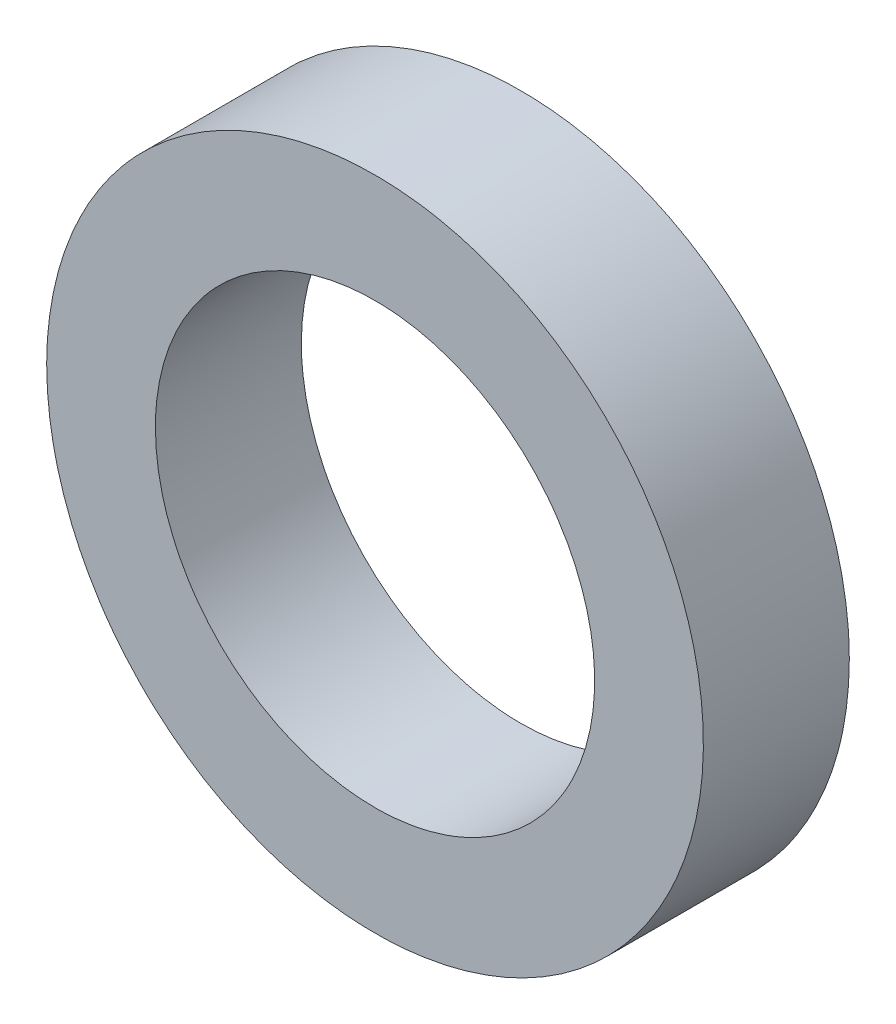
ISO-10303-21;
HEADER;
FILE_DESCRIPTION(('STEP AP214'),'2;1');
FILE_NAME('part.step','',(''),(''),'','','');
FILE_SCHEMA(('AUTOMOTIVE_DESIGN { 1 0 10303 214 1 1 1 1 }'));
ENDSEC;
DATA;
#1=APPLICATION_CONTEXT('core data for automotive mechanical design processes');
#2=APPLICATION_PROTOCOL_DEFINITION('international standard','automotive_design',2000,#1);
#3=PRODUCT_CONTEXT('',#1,'mechanical');
#4=PRODUCT('Part','Part','',(#3));
#5=PRODUCT_RELATED_PRODUCT_CATEGORY('part','',(#4));
#6=PRODUCT_DEFINITION_FORMATION('','',#4);
#7=PRODUCT_DEFINITION_CONTEXT('part definition',#1,'design');
#8=PRODUCT_DEFINITION('design','',#6,#7);
#9=PRODUCT_DEFINITION_SHAPE('','',#8);
#10=(LENGTH_UNIT() NAMED_UNIT(*) SI_UNIT(.MILLI.,.METRE.));
#11=(NAMED_UNIT(*) PLANE_ANGLE_UNIT() SI_UNIT($,.RADIAN.));
#12=(NAMED_UNIT(*) SI_UNIT($,.STERADIAN.) SOLID_ANGLE_UNIT());
#13=UNCERTAINTY_MEASURE_WITH_UNIT(LENGTH_MEASURE(1.E-05),#10,'distance_accuracy_value','');
#14=(GEOMETRIC_REPRESENTATION_CONTEXT(3) GLOBAL_UNCERTAINTY_ASSIGNED_CONTEXT((#13)) GLOBAL_UNIT_ASSIGNED_CONTEXT((#10,
#11,#12)) REPRESENTATION_CONTEXT('',''));
#15=CARTESIAN_POINT('',(0.,0.,0.));
#16=DIRECTION('',(0.,0.,1.));
#17=DIRECTION('',(1.,0.,0.));
#18=AXIS2_PLACEMENT_3D('',#15,#16,#17);
#19=CARTESIAN_POINT('',(6.,0.,31.3));
#20=CARTESIAN_POINT('',(6.,0.,29.3));
#21=(BOUNDED_CURVE() B_SPLINE_CURVE(1,(#19,#20),.UNSPECIFIED.,.F.,
.F.) B_SPLINE_CURVE_WITH_KNOTS((2,2),(0.,1.),
.UNSPECIFIED.) CURVE() GEOMETRIC_REPRESENTATION_ITEM() RATIONAL_B_SPLINE_CURVE((1.,1.)) REPRESENTATION_ITEM(''));
#22=CARTESIAN_POINT('',(10.5,0.,29.3));
#23=DIRECTION('',(0.,0.,-1.));
#24=AXIS1_PLACEMENT('',#22,#23);
#25=SURFACE_OF_REVOLUTION('',#21,#24);
#26=CARTESIAN_POINT('',(6.,-2.6937762327139E-10,31.3));
#27=CARTESIAN_POINT('',(6.00000075711518,-0.126345888243587,31.3));
#28=CARTESIAN_POINT('',(6.0053258516271,-0.252714995639869,31.3));
#29=CARTESIAN_POINT('',(6.02659161018522,-0.504579922893915,31.3));
#30=CARTESIAN_POINT('',(6.0425354082801,-0.630075473873856,31.3));
#31=CARTESIAN_POINT('',(6.0849668385989,-0.879488579669032,31.3));
#32=CARTESIAN_POINT('',(6.11147120795696,-1.00340330580344,31.3));
#33=CARTESIAN_POINT('',(6.17484109540289,-1.24862839271339,31.3));
#34=CARTESIAN_POINT('',(6.21171502163007,-1.36993655368026,31.3));
#35=CARTESIAN_POINT('',(6.33738125664592,-1.72813230663829,31.3));
#36=CARTESIAN_POINT('',(6.44132124238062,-1.95989398203193,31.3));
#37=CARTESIAN_POINT('',(6.68669098236688,-2.40265211702302,31.3));
#38=CARTESIAN_POINT('',(6.8281221617637,-2.61364778682825,31.3));
#39=CARTESIAN_POINT('',(7.0651658796266,-2.90998197074079,31.3));
#40=CARTESIAN_POINT('',(7.14839252706893,-3.00545596733886,31.3));
#41=CARTESIAN_POINT('',(7.32252955954329,-3.18898845132688,31.3));
#42=CARTESIAN_POINT('',(7.41343245892862,-3.27705399963326,31.3));
#43=CARTESIAN_POINT('',(7.60236863328452,-3.44524943311484,31.3));
#44=CARTESIAN_POINT('',(7.70040511960203,-3.52537570543001,31.3));
#45=CARTESIAN_POINT('',(7.90290374292955,-3.67710475387021,31.3));
#46=CARTESIAN_POINT('',(8.00736736293391,-3.74870555155881,31.3));
#47=CARTESIAN_POINT('',(8.22191990853169,-3.88282771925992,31.3));
#48=CARTESIAN_POINT('',(8.33200692234022,-3.94535214755635,31.3));
#49=CARTESIAN_POINT('',(8.55709534180762,-4.06092787559734,31.3));
#50=CARTESIAN_POINT('',(8.67209854340924,-4.11397567612515,31.3));
#51=CARTESIAN_POINT('',(8.90612952534069,-4.21017454227091,31.3));
#52=CARTESIAN_POINT('',(9.02515575188753,-4.25332937977116,31.3));
#53=CARTESIAN_POINT('',(9.2664330930061,-4.32947371902587,31.3));
#54=CARTESIAN_POINT('',(9.38868539768695,-4.3624594107949,31.3));
#55=CARTESIAN_POINT('',(9.75887477059496,-4.44573644165291,31.3));
#56=CARTESIAN_POINT('',(10.0104981527046,-4.48045178750392,31.3));
#57=CARTESIAN_POINT('',(10.5159997363534,-4.50708378966814,31.3));
#58=CARTESIAN_POINT('',(10.7698779378925,-4.49900044598134,31.3));
#59=CARTESIAN_POINT('',(11.1467684743442,-4.4550828047009,31.3));
#60=CARTESIAN_POINT('',(11.2718100379565,-4.43512561976273,31.3));
#61=CARTESIAN_POINT('',(11.5197527061042,-4.38475549915935,31.3));
#62=CARTESIAN_POINT('',(11.6426545938186,-4.3543464774409,31.3));
#63=CARTESIAN_POINT('',(11.8854982867655,-4.28327142452189,31.3));
#64=CARTESIAN_POINT('',(12.0054389431545,-4.24260147905303,31.3));
#65=CARTESIAN_POINT('',(12.2414256406672,-4.15131717543181,31.3));
#66=CARTESIAN_POINT('',(12.3574731001043,-4.10070648583707,31.3));
#67=CARTESIAN_POINT('',(12.5849310529537,-3.98987133628193,31.3));
#68=CARTESIAN_POINT('',(12.6963399665197,-3.92964363408343,31.3));
#69=CARTESIAN_POINT('',(12.913660804081,-3.80003248428611,31.3));
#70=CARTESIAN_POINT('',(13.0195739949729,-3.73065115999981,31.3));
#71=CARTESIAN_POINT('',(13.2251377017827,-3.58323968057264,31.3));
#72=CARTESIAN_POINT('',(13.3247910316415,-3.50521345572992,31.3));
#73=CARTESIAN_POINT('',(13.5172490939623,-3.34099478137929,31.3));
#74=CARTESIAN_POINT('',(13.6100471241572,-3.25479452347449,31.3));
#75=CARTESIAN_POINT('',(13.8769164865168,-2.98500865251915,31.3));
#76=CARTESIAN_POINT('',(14.0397355005387,-2.79004219423704,31.3));
#77=CARTESIAN_POINT('',(14.3302705772644,-2.37551783476742,31.3));
#78=CARTESIAN_POINT('',(14.457987974235,-2.15596086874983,31.3));
#79=CARTESIAN_POINT('',(14.6205966550807,-1.8129526808387,31.3));
#80=CARTESIAN_POINT('',(14.6700131440081,-1.69619067085795,31.3));
#81=CARTESIAN_POINT('',(14.7587997294127,-1.45898184273923,31.3));
#82=CARTESIAN_POINT('',(14.7981779563333,-1.33853809573375,31.3));
#83=CARTESIAN_POINT('',(14.8665820622822,-1.09496428369583,31.3));
#84=CARTESIAN_POINT('',(14.8956242885602,-0.971838790372174,31.3));
#85=CARTESIAN_POINT('',(14.9432375239037,-0.723602705389449,31.3));
#86=CARTESIAN_POINT('',(14.9618116214151,-0.59849271043604,31.3));
#87=CARTESIAN_POINT('',(14.9833857117301,-0.394324004665475,31.3));
#88=CARTESIAN_POINT('',(14.9896140981964,-0.315592182409609,31.3));
#89=CARTESIAN_POINT('',(14.9979214788967,-0.157909930030292,31.3));
#90=CARTESIAN_POINT('',(15.0000004731306,-0.07895949990684,31.3));
#91=CARTESIAN_POINT('',(14.9999992429269,0.12634588674299,31.3));
#92=CARTESIAN_POINT('',(14.9946741484572,0.252714994140696,31.3));
#93=CARTESIAN_POINT('',(14.9734083899831,0.504579921401214,31.3));
#94=CARTESIAN_POINT('',(14.9574645919302,0.630075472386204,31.3));
#95=CARTESIAN_POINT('',(14.9150331616946,0.879488578195656,31.3));
#96=CARTESIAN_POINT('',(14.8885287923778,1.00340330433929,31.3));
#97=CARTESIAN_POINT('',(14.8251589050135,1.24862839127106,31.3));
#98=CARTESIAN_POINT('',(14.7882849788267,1.36993655225053,31.3));
#99=CARTESIAN_POINT('',(14.6626187439301,1.72813230525073,31.3));
#100=CARTESIAN_POINT('',(14.5586787582727,1.95989398067901,31.3));
#101=CARTESIAN_POINT('',(14.313309018434,2.40265211575189,31.3));
#102=CARTESIAN_POINT('',(14.1718778391075,2.61364778560428,31.3));
#103=CARTESIAN_POINT('',(13.9348341213434,2.90998196959583,31.3));
#104=CARTESIAN_POINT('',(13.8516074739329,3.00545596622163,31.3));
#105=CARTESIAN_POINT('',(13.6774704415198,3.18898845026767,31.3));
#106=CARTESIAN_POINT('',(13.5865675421638,3.27705399860433,31.3));
#107=CARTESIAN_POINT('',(13.397631367864,3.44524943214889,31.3));
#108=CARTESIAN_POINT('',(13.2995948815732,3.52537570449676,31.3));
#109=CARTESIAN_POINT('',(13.0970962582962,3.67710475300449,31.3));
#110=CARTESIAN_POINT('',(12.9926326383157,3.74870555072793,31.3));
#111=CARTESIAN_POINT('',(12.7780800927626,3.88282771850056,31.3));
#112=CARTESIAN_POINT('',(12.6679930789749,3.94535214683369,31.3));
#113=CARTESIAN_POINT('',(12.442904659546,4.06092787494971,31.3));
#114=CARTESIAN_POINT('',(12.3279014579621,4.11397567551586,31.3));
#115=CARTESIAN_POINT('',(12.0938704760627,4.21017454173963,31.3));
#116=CARTESIAN_POINT('',(11.9748442495302,4.25332937927955,31.3));
#117=CARTESIAN_POINT('',(11.7335669084371,4.32947371861468,31.3));
#118=CARTESIAN_POINT('',(11.6113146037672,4.36245941042446,31.3));
#119=CARTESIAN_POINT('',(11.241125230887,4.44573644140587,31.3));
#120=CARTESIAN_POINT('',(10.9895018487888,4.48045178734075,31.3));
#121=CARTESIAN_POINT('',(10.484000265149,4.50708378967347,31.3));
#122=CARTESIAN_POINT('',(10.2301220636072,4.4990004460713,31.3));
#123=CARTESIAN_POINT('',(9.85323152714079,4.45508280491649,31.3));
#124=CARTESIAN_POINT('',(9.72818996352185,4.43512562002,31.3));
#125=CARTESIAN_POINT('',(9.4802472953574,4.38475549949926,31.3));
#126=CARTESIAN_POINT('',(9.3573454076328,4.35434647782177,31.3));
#127=CARTESIAN_POINT('',(9.11450171466221,4.28327142498372,31.3));
#128=CARTESIAN_POINT('',(8.99456105825965,4.24260147955484,31.3));
#129=CARTESIAN_POINT('',(8.75857436071658,4.15131717601228,31.3));
#130=CARTESIAN_POINT('',(8.64252690126255,4.10070648645623,31.3));
#131=CARTESIAN_POINT('',(8.41506894837624,3.98987133697692,31.3));
#132=CARTESIAN_POINT('',(8.3036600347902,3.92964363481556,31.3));
#133=CARTESIAN_POINT('',(8.08633919718572,3.8000324850907,31.3));
#134=CARTESIAN_POINT('',(7.98042600627076,3.73065116083973,31.3));
#135=CARTESIAN_POINT('',(7.77486229941181,3.58323968148108,31.3));
#136=CARTESIAN_POINT('',(7.67520896952696,3.50521345667157,31.3));
#137=CARTESIAN_POINT('',(7.48275090715136,3.34099478238506,31.3));
#138=CARTESIAN_POINT('',(7.38995287692778,3.25479452451118,31.3));
#139=CARTESIAN_POINT('',(7.12308351447821,2.9850086536448,31.3));
#140=CARTESIAN_POINT('',(6.9602645003913,2.79004219541698,31.3));
#141=CARTESIAN_POINT('',(6.66972942352741,2.37551783604421,31.3));
#142=CARTESIAN_POINT('',(6.54201202648363,2.15596087006918,31.3));
#143=CARTESIAN_POINT('',(6.37940334552374,1.81295268221252,31.3));
#144=CARTESIAN_POINT('',(6.32998685655756,1.69619067224854,31.3));
#145=CARTESIAN_POINT('',(6.24120027107411,1.4589818441601,31.3));
#146=CARTESIAN_POINT('',(6.20182204411344,1.33853809716812,31.3));
#147=CARTESIAN_POINT('',(6.13341793808326,1.09496428515315,31.3));
#148=CARTESIAN_POINT('',(6.10437571176404,0.971838791838917,31.3));
#149=CARTESIAN_POINT('',(6.05676247633764,0.723602706871464,31.3));
#150=CARTESIAN_POINT('',(6.03818837878446,0.598492711923901,31.3));
#151=CARTESIAN_POINT('',(6.01661428834876,0.394324005662689,31.3));
#152=CARTESIAN_POINT('',(6.01038590182986,0.315592182908908,31.3));
#153=CARTESIAN_POINT('',(6.002078521077,0.15790992953099,31.3));
#154=CARTESIAN_POINT('',(5.99999952684305,0.0789594989068522,31.3));
#155=CARTESIAN_POINT('',(6.,-2.6937762327139E-10,31.3));
#156=B_SPLINE_CURVE_WITH_KNOTS('',3,(#26,#27,#28,#29,#30,#31,#32,#33,#34,#35,#36,#37,#38,#39,
#40,#41,#42,#43,#44,#45,#46,#47,#48,#49,#50,#51,#52,#53,#54,#55,#56,#57,#58,#59,#60,#61,#62,#63,
#64,#65,#66,#67,#68,#69,#70,#71,#72,#73,#74,#75,#76,#77,#78,#79,#80,#81,#82,#83,#84,#85,#86,#87,
#88,#89,#90,#91,#92,#93,#94,#95,#96,#97,#98,#99,#100,#101,#102,#103,#104,#105,#106,#107,#108,
#109,#110,#111,#112,#113,#114,#115,#116,#117,#118,#119,#120,#121,#122,#123,#124,#125,#126,#127,
#128,#129,#130,#131,#132,#133,#134,#135,#136,#137,#138,#139,#140,#141,#142,#143,#144,#145,#146,
#147,#148,#149,#150,#151,#152,#153,#154,#155),.UNSPECIFIED.,.T.,.F.,(4,2,2,2,2,2,2,2,2,2,2,2,2,
2,2,2,2,2,2,2,2,2,2,2,2,2,2,2,2,2,2,2,2,2,2,2,2,2,2,2,2,2,2,2,2,2,2,2,2,2,2,2,2,2,2,2,2,2,2,2,2,
2,2,2,4),(0.,0.378964974276814,0.758041847459797,1.13772191331395,1.51771073427411,
2.27587701437876,3.03407211864041,3.41366643018824,3.79289475564697,4.17229486835694,
4.55178285442527,4.931142673675,5.31064228217768,5.68999695761862,6.06949359033223,
6.82767428251637,7.58585497470049,7.96535160741409,8.34470628285502,8.72420589135772,
9.10356571060745,9.48305369667585,9.86245380938588,10.2416821348445,10.6212764463923,
11.379471550654,12.1376378307586,12.5176266517197,12.897306717575,13.2763835907573,
13.6553485650327,13.8921816338769,14.1290147027211,14.5079796769966,14.8870565501788,
15.2667366160341,15.6467254369952,16.4048917170998,17.1630868213615,17.5426811329093,
17.921909458368,18.301309571078,18.6807975571464,19.0601573763961,19.4396569848988,
19.8190116603398,20.1985082930534,20.9566889852375,21.7148696774216,22.0943663101352,
22.4737209855762,22.8532205940789,23.2325804133286,23.6120683993969,23.9914685121069,
24.3706968375656,24.7502911491134,25.5084862533751,26.2666525334797,26.6466413544399,
27.026321420294,27.405398293477,27.7843632677538,28.0211963380975,28.2580294084412),.UNSPECIFIED.);
#157=CARTESIAN_POINT('',(6.,-2.6937762327139E-10,31.3));
#158=VERTEX_POINT('',#157);
#159=EDGE_CURVE('E20',#158,#158,#156,.T.);
#160=ORIENTED_EDGE('',*,*,#159,.F.);
#161=EDGE_LOOP('',(#160));
#162=FACE_BOUND('',#161,.T.);
#163=CARTESIAN_POINT('',(15.,-1.23062105352878E-09,29.3));
#164=CARTESIAN_POINT('',(14.9999992428578,-0.12634588920483,29.3));
#165=CARTESIAN_POINT('',(14.9946741483189,-0.252714996599976,29.3));
#166=CARTESIAN_POINT('',(14.973408389707,-0.504579923849479,29.3));
#167=CARTESIAN_POINT('',(14.9574645915853,-0.630075474826015,29.3));
#168=CARTESIAN_POINT('',(14.9150331612132,-0.879488580612127,29.3));
#169=CARTESIAN_POINT('',(14.8885287918287,-1.00340330674088,29.3));
#170=CARTESIAN_POINT('',(14.8251589043304,-1.24862839363728,29.3));
#171=CARTESIAN_POINT('',(14.7882849780773,-1.36993655459628,29.3));
#172=CARTESIAN_POINT('',(14.6626187429849,-1.72813230752747,29.3));
#173=CARTESIAN_POINT('',(14.5586787572007,-1.95989398289891,29.3));
#174=CARTESIAN_POINT('',(14.3133090171199,-2.40265211783758,29.3));
#175=CARTESIAN_POINT('',(14.171877837678,-2.6136477876126,29.3));
#176=CARTESIAN_POINT('',(13.9348341197518,-2.9099819714745,29.3));
#177=CARTESIAN_POINT('',(13.8516074722891,-3.0054559680548,29.3));
#178=CARTESIAN_POINT('',(13.6774704397755,-3.18898845200562,29.3));
#179=CARTESIAN_POINT('',(13.5865675403714,-3.27705400029258,29.3));
#180=CARTESIAN_POINT('',(13.3976313659795,-3.4452494337338,29.3));
#181=CARTESIAN_POINT('',(13.2995948796449,-3.52537570602803,29.3));
#182=CARTESIAN_POINT('',(13.097096256285,-3.67710475442498,29.3));
#183=CARTESIAN_POINT('',(12.9926326362653,-3.74870555209126,29.3));
#184=CARTESIAN_POINT('',(12.7780800906389,-3.88282771974654,29.3));
#185=CARTESIAN_POINT('',(12.667993076817,-3.94535214801946,29.3));
#186=CARTESIAN_POINT('',(12.4429046573249,-4.06092787601236,29.3));
#187=CARTESIAN_POINT('',(12.327901455712,-4.11397567651561,29.3));
#188=CARTESIAN_POINT('',(12.09387047376,-4.21017454261137,29.3));
#189=CARTESIAN_POINT('',(11.9748442472039,-4.2533293800862,29.3));
#190=CARTESIAN_POINT('',(11.7335669060691,-4.32947371928937,29.3));
#191=CARTESIAN_POINT('',(11.6113146013812,-4.36245941103229,29.3));
#192=CARTESIAN_POINT('',(11.2411252284554,-4.44573644181122,29.3));
#193=CARTESIAN_POINT('',(10.9895018463383,-4.48045178760849,29.3));
#194=CARTESIAN_POINT('',(10.4840002626839,-4.50708378966472,29.3));
#195=CARTESIAN_POINT('',(10.2301220611465,-4.49900044592369,29.3));
#196=CARTESIAN_POINT('',(9.85323152470412,-4.45508280456274,29.3));
#197=CARTESIAN_POINT('',(9.7281899610961,-4.43512561959786,29.3));
#198=CARTESIAN_POINT('',(9.4802472929592,-4.38475549894152,29.3));
#199=CARTESIAN_POINT('',(9.35734540525124,-4.35434647719681,29.3));
#200=CARTESIAN_POINT('',(9.11450171231952,-4.28327142422593,29.3));
#201=CARTESIAN_POINT('',(8.99456105593921,-4.24260147873145,29.3));
#202=CARTESIAN_POINT('',(8.75857435844606,-4.15131717505983,29.3));
#203=CARTESIAN_POINT('',(8.6425268990197,-4.1007064854403,29.3));
#204=CARTESIAN_POINT('',(8.41506894619399,-3.98987133583657,29.3));
#205=CARTESIAN_POINT('',(8.30366003264087,-3.92964363361427,29.3));
#206=CARTESIAN_POINT('',(8.08633919510725,-3.80003248377053,29.3));
#207=CARTESIAN_POINT('',(7.98042600423022,-3.73065115946161,29.3));
#208=CARTESIAN_POINT('',(7.7748622974519,-3.58323967999053,29.3));
#209=CARTESIAN_POINT('',(7.67520896760975,-3.50521345512652,29.3));
#210=CARTESIAN_POINT('',(7.482750905324,-3.34099478073477,29.3));
#211=CARTESIAN_POINT('',(7.38995287514758,-3.25479452281015,29.3));
#212=CARTESIAN_POINT('',(7.12308351284557,-2.9850086517978,29.3));
#213=CARTESIAN_POINT('',(6.96026449886528,-2.79004219348092,29.3));
#214=CARTESIAN_POINT('',(6.66972942222812,-2.37551783394924,29.3));
#215=CARTESIAN_POINT('',(6.54201202530444,-2.15596086790437,29.3));
#216=CARTESIAN_POINT('',(6.37940334453202,-1.8129526799585,29.3));
#217=CARTESIAN_POINT('',(6.32998685562959,-1.69619066996719,29.3));
#218=CARTESIAN_POINT('',(6.24120027027568,-1.45898184182951,29.3));
#219=CARTESIAN_POINT('',(6.20182204338081,-1.33853809481561,29.3));
#220=CARTESIAN_POINT('',(6.13341793748393,-1.09496428276308,29.3));
#221=CARTESIAN_POINT('',(6.10437571123216,-0.971838789433221,29.3));
#222=CARTESIAN_POINT('',(6.05676247594173,-0.723602704440324,29.3));
#223=CARTESIAN_POINT('',(6.03818837845706,-0.598492709482948,29.3));
#224=CARTESIAN_POINT('',(6.01661428818562,-0.394324003707775,29.3));
#225=CARTESIAN_POINT('',(6.01038590173614,-0.31559218145058,29.3));
#226=CARTESIAN_POINT('',(6.00207852106958,-0.157909929069491,29.3));
#227=CARTESIAN_POINT('',(5.9999995268525,-0.0789594989455955,29.3));
#228=CARTESIAN_POINT('',(6.00000075710005,0.126345887704233,29.3));
#229=CARTESIAN_POINT('',(6.0053258515968,0.252714995100802,29.3));
#230=CARTESIAN_POINT('',(6.02659161012464,0.504579922356777,29.3));
#231=CARTESIAN_POINT('',(6.04253540820441,0.630075473338361,29.3));
#232=CARTESIAN_POINT('',(6.08496683849326,0.87948857913875,29.3));
#233=CARTESIAN_POINT('',(6.11147120783652,1.00340330527672,29.3));
#234=CARTESIAN_POINT('',(6.17484109525322,1.24862839219495,29.3));
#235=CARTESIAN_POINT('',(6.21171502146595,1.36993655316655,29.3));
#236=CARTESIAN_POINT('',(6.33738125643902,1.72813230613991,29.3));
#237=CARTESIAN_POINT('',(6.44132124214596,1.95989398154599,29.3));
#238=CARTESIAN_POINT('',(6.68669098207921,2.40265211656645,29.3));
#239=CARTESIAN_POINT('',(6.82812216145077,2.61364778638863,29.3));
#240=CARTESIAN_POINT('',(7.06516587927819,2.90998197032954,29.3));
#241=CARTESIAN_POINT('',(7.14839252670908,3.00545596693757,29.3));
#242=CARTESIAN_POINT('',(7.32252955916144,3.1889884509464,29.3));
#243=CARTESIAN_POINT('',(7.41343245853621,3.27705399926365,29.3));
#244=CARTESIAN_POINT('',(7.60236863287196,3.44524943276786,29.3));
#245=CARTESIAN_POINT('',(7.70040511917989,3.52537570509478,29.3));
#246=CARTESIAN_POINT('',(7.90290374248928,3.67710475355925,29.3));
#247=CARTESIAN_POINT('',(8.00736736248509,3.74870555126038,29.3));
#248=CARTESIAN_POINT('',(8.22191990806682,3.88282771898718,29.3));
#249=CARTESIAN_POINT('',(8.33200692186787,3.9453521472968,29.3));
#250=CARTESIAN_POINT('',(8.55709534132144,4.06092787536474,29.3));
#251=CARTESIAN_POINT('',(8.67209854291672,4.11397567590631,29.3));
#252=CARTESIAN_POINT('',(8.90612952483665,4.21017454208009,29.3));
#253=CARTESIAN_POINT('',(9.02515575137832,4.25332937959459,29.3));
#254=CARTESIAN_POINT('',(9.26643309248776,4.32947371887818,29.3));
#255=CARTESIAN_POINT('',(9.38868539716467,4.36245941066185,29.3));
#256=CARTESIAN_POINT('',(9.75887477006269,4.44573644156418,29.3));
#257=CARTESIAN_POINT('',(10.0104981521682,4.48045178744532,29.3));
#258=CARTESIAN_POINT('',(10.5159997358138,4.50708378967005,29.3));
#259=CARTESIAN_POINT('',(10.7698779373538,4.49900044601365,29.3));
#260=CARTESIAN_POINT('',(11.1467684738109,4.45508280477833,29.3));
#261=CARTESIAN_POINT('',(11.2718100374255,4.43512561985513,29.3));
#262=CARTESIAN_POINT('',(11.5197527055792,4.38475549928143,29.3));
#263=CARTESIAN_POINT('',(11.6426545932973,4.35434647757769,29.3));
#264=CARTESIAN_POINT('',(11.8854982862527,4.28327142468776,29.3));
#265=CARTESIAN_POINT('',(12.0054389426466,4.24260147923326,29.3));
#266=CARTESIAN_POINT('',(12.2414256401702,4.1513171756403,29.3));
#267=CARTESIAN_POINT('',(12.3574730996134,4.10070648605945,29.3));
#268=CARTESIAN_POINT('',(12.584931052476,3.98987133653156,29.3));
#269=CARTESIAN_POINT('',(12.6963399660492,3.9296436343464,29.3));
#270=CARTESIAN_POINT('',(12.913660803626,3.80003248457512,29.3));
#271=CARTESIAN_POINT('',(13.0195739945261,3.73065116030152,29.3));
#272=CARTESIAN_POINT('',(13.2251377013536,3.58323968089897,29.3));
#273=CARTESIAN_POINT('',(13.3247910312218,3.50521345606816,29.3));
#274=CARTESIAN_POINT('',(13.5172490935623,3.34099478174055,29.3));
#275=CARTESIAN_POINT('',(13.6100471237675,3.25479452384685,29.3));
#276=CARTESIAN_POINT('',(13.8769164861594,2.98500865292346,29.3));
#277=CARTESIAN_POINT('',(14.0397355002047,2.79004219466086,29.3));
#278=CARTESIAN_POINT('',(14.33027057698,2.37551783522603,29.3));
#279=CARTESIAN_POINT('',(14.4579879739769,2.15596086922372,29.3));
#280=CARTESIAN_POINT('',(14.6205966548635,1.81295268133232,29.3));
#281=CARTESIAN_POINT('',(14.6700131438048,1.69619067135779,29.3));
#282=CARTESIAN_POINT('',(14.7587997292375,1.45898184325038,29.3));
#283=CARTESIAN_POINT('',(14.7981779561725,1.33853809624999,29.3));
#284=CARTESIAN_POINT('',(14.8665820621506,1.09496428422041,29.3));
#285=CARTESIAN_POINT('',(14.8956242884436,0.971838790899972,29.3));
#286=CARTESIAN_POINT('',(14.9432375238169,0.723602705922348,29.3));
#287=CARTESIAN_POINT('',(14.9618116213434,0.598492710970817,29.3));
#288=CARTESIAN_POINT('',(14.9833857117355,0.394324004704997,29.3));
#289=CARTESIAN_POINT('',(14.9896140982376,0.315592181949885,29.3));
#290=CARTESIAN_POINT('',(14.9979214789567,0.157909928570191,29.3));
#291=CARTESIAN_POINT('',(15.0000004731738,0.078959497945609,29.3));
#292=CARTESIAN_POINT('',(15.,-1.23062105352878E-09,29.3));
#293=B_SPLINE_CURVE_WITH_KNOTS('',3,(#163,#164,#165,#166,#167,#168,#169,#170,#171,#172,#173,
#174,#175,#176,#177,#178,#179,#180,#181,#182,#183,#184,#185,#186,#187,#188,#189,#190,#191,#192,
#193,#194,#195,#196,#197,#198,#199,#200,#201,#202,#203,#204,#205,#206,#207,#208,#209,#210,#211,
#212,#213,#214,#215,#216,#217,#218,#219,#220,#221,#222,#223,#224,#225,#226,#227,#228,#229,#230,
#231,#232,#233,#234,#235,#236,#237,#238,#239,#240,#241,#242,#243,#244,#245,#246,#247,#248,#249,
#250,#251,#252,#253,#254,#255,#256,#257,#258,#259,#260,#261,#262,#263,#264,#265,#266,#267,#268,
#269,#270,#271,#272,#273,#274,#275,#276,#277,#278,#279,#280,#281,#282,#283,#284,#285,#286,#287,
#288,#289,#290,#291,#292),.UNSPECIFIED.,.T.,.F.,(4,2,2,2,2,2,2,2,2,2,2,2,2,2,2,2,2,2,2,2,2,2,2,
2,2,2,2,2,2,2,2,2,2,2,2,2,2,2,2,2,2,2,2,2,2,2,2,2,2,2,2,2,2,2,2,2,2,2,2,2,2,2,2,2,4),(0.,
0.378964974276814,0.758041847459798,1.13772191331395,1.51771073427411,2.27587701437876,
3.03407211864041,3.41366643018824,3.79289475564697,4.17229486835694,4.55178285442527,
4.93114267367499,5.31064228217767,5.68999695761861,6.06949359033223,6.82767428251636,
7.58585497470049,7.9653516074141,8.34470628285503,8.72420589135772,9.10356571060745,
9.48305369667585,9.86245380938588,10.2416821348445,10.6212764463923,11.379471550654,
12.1376378307586,12.5176266517197,12.897306717575,13.2763835907573,13.6553485650327,
13.8921816338769,14.1290147027211,14.5079796769966,14.8870565501788,15.2667366160341,
15.6467254369952,16.4048917170998,17.1630868213615,17.5426811329093,17.921909458368,
18.301309571078,18.6807975571464,19.0601573763961,19.4396569848988,19.8190116603397,
20.1985082930533,20.9566889852375,21.7148696774216,22.0943663101352,22.4737209855762,
22.8532205940788,23.2325804133286,23.6120683993969,23.9914685121069,24.3706968375656,
24.7502911491134,25.5084862533751,26.2666525334797,26.6466413544399,27.026321420294,
27.405398293477,27.7843632677538,28.0211963380975,28.2580294084412),.UNSPECIFIED.);
#294=CARTESIAN_POINT('',(15.,-1.23062105352878E-09,29.3));
#295=VERTEX_POINT('',#294);
#296=EDGE_CURVE('E38',#295,#295,#293,.T.);
#297=ORIENTED_EDGE('',*,*,#296,.F.);
#298=EDGE_LOOP('',(#297));
#299=FACE_BOUND('',#298,.T.);
#300=ADVANCED_FACE('F15',(#162,#299),#25,.T.);
#301=CARTESIAN_POINT('',(5.946,-4.554,31.3));
#302=DIRECTION('',(0.,0.,1.));
#303=DIRECTION('',(1.,0.,0.));
#304=AXIS2_PLACEMENT_3D('',#301,#302,#303);
#305=PLANE('',#304);
#306=CARTESIAN_POINT('',(7.49,-1.8018369912153E-10,31.3));
#307=CARTESIAN_POINT('',(7.49000051978817,-0.0848339374648166,31.3));
#308=CARTESIAN_POINT('',(7.49358969548864,-0.169684015777592,31.3));
#309=CARTESIAN_POINT('',(7.50792295194002,-0.338793597877469,31.3));
#310=CARTESIAN_POINT('',(7.5186692032373,-0.423052914666627,31.3));
#311=CARTESIAN_POINT('',(7.54726793879551,-0.590504189178821,31.3));
#312=CARTESIAN_POINT('',(7.56513181230002,-0.673694214575358,31.3));
#313=CARTESIAN_POINT('',(7.60784165906604,-0.838311689887825,31.3));
#314=CARTESIAN_POINT('',(7.63269328548678,-0.919737654977212,31.3));
#315=CARTESIAN_POINT('',(7.71716839888164,-1.15952988329598,31.3));
#316=CARTESIAN_POINT('',(7.78689336855222,-1.31446279777084,31.3));
#317=CARTESIAN_POINT('',(7.95140130493632,-1.61040592697779,31.3));
#318=CARTESIAN_POINT('',(8.04618509253659,-1.75141568540171,31.3));
#319=CARTESIAN_POINT('',(8.20499736970529,-1.94942479438598,31.3));
#320=CARTESIAN_POINT('',(8.26074948834722,-2.01321420909856,31.3));
#321=CARTESIAN_POINT('',(8.37738536908381,-2.13582574011263,31.3));
#322=CARTESIAN_POINT('',(8.43826413686096,-2.1946525815448,31.3));
#323=CARTESIAN_POINT('',(8.56479028136268,-2.30699445229329,31.3));
#324=CARTESIAN_POINT('',(8.63043981906774,-2.36050704815451,31.3));
#325=CARTESIAN_POINT('',(8.76600756507694,-2.46181692995303,31.3));
#326=CARTESIAN_POINT('',(8.83592675749379,-2.50961289069508,31.3));
#327=CARTESIAN_POINT('',(9.05132620729722,-2.64386029713749,31.3));
#328=CARTESIAN_POINT('',(9.20258221084667,-2.72128991304478,31.3));
#329=CARTESIAN_POINT('',(9.51586507582583,-2.84960922581822,31.3));
#330=CARTESIAN_POINT('',(9.67789181725413,-2.90049921831784,31.3));
#331=CARTESIAN_POINT('',(10.0082102074171,-2.97436861936578,31.3));
#332=CARTESIAN_POINT('',(10.1765018910612,-2.99734787236604,31.3));
#333=CARTESIAN_POINT('',(10.5145542611025,-3.01471946748338,31.3));
#334=CARTESIAN_POINT('',(10.6843149474903,-3.00911180978252,31.3));
#335=CARTESIAN_POINT('',(11.0204653474149,-2.96949042951565,31.3));
#336=CARTESIAN_POINT('',(11.1868550791664,-2.93547686048049,31.3));
#337=CARTESIAN_POINT('',(11.5116409865707,-2.83994616418004,31.3));
#338=CARTESIAN_POINT('',(11.6700370757447,-2.77842873943644,31.3));
#339=CARTESIAN_POINT('',(11.8980627016694,-2.66696780696577,31.3));
#340=CARTESIAN_POINT('',(11.9725127903972,-2.62659064704456,31.3));
#341=CARTESIAN_POINT('',(12.1177509281465,-2.53971075288634,31.3));
#342=CARTESIAN_POINT('',(12.1885398211859,-2.49320943929963,31.3));
#343=CARTESIAN_POINT('',(12.3259149589382,-2.39442880420765,31.3));
#344=CARTESIAN_POINT('',(12.3925030947607,-2.34215211226507,31.3));
#345=CARTESIAN_POINT('',(12.5210929516919,-2.23214193242845,31.3));
#346=CARTESIAN_POINT('',(12.583090184325,-2.17440322675224,31.3));
#347=CARTESIAN_POINT('',(12.7613630634043,-1.99371557303313,31.3));
#348=CARTESIAN_POINT('',(12.8701018769358,-1.86316396076377,31.3));
#349=CARTESIAN_POINT('',(13.0640785628894,-1.585642120668,31.3));
#350=CARTESIAN_POINT('',(13.1493173342814,-1.43867252119703,31.3));
#351=CARTESIAN_POINT('',(13.257787825636,-1.20909723812652,31.3));
#352=CARTESIAN_POINT('',(13.2907410751818,-1.13095329060588,31.3));
#353=CARTESIAN_POINT('',(13.3499244294553,-0.97220925309921,31.3));
#354=CARTESIAN_POINT('',(13.3761599692855,-0.89161120810926,31.3));
#355=CARTESIAN_POINT('',(13.4217038099324,-0.728628157728064,31.3));
#356=CARTESIAN_POINT('',(13.4410231252998,-0.646246217246028,31.3));
#357=CARTESIAN_POINT('',(13.4726559921687,-0.480163698404571,31.3));
#358=CARTESIAN_POINT('',(13.4849716320087,-0.396463520772017,31.3));
#359=CARTESIAN_POINT('',(13.499158186068,-0.260525170303254,31.3));
#360=CARTESIAN_POINT('',(13.5032225843981,-0.208506037028908,31.3));
#361=CARTESIAN_POINT('',(13.5086436580929,-0.104326637730774,31.3));
#362=CARTESIAN_POINT('',(13.5100003196125,-0.0521663709867137,31.3));
#363=CARTESIAN_POINT('',(13.5099994802401,0.084833936461081,31.3));
#364=CARTESIAN_POINT('',(13.5064103045679,0.169684014774815,31.3));
#365=CARTESIAN_POINT('',(13.492077048173,0.338793596879056,31.3));
#366=CARTESIAN_POINT('',(13.4813307969039,0.423052913671616,31.3));
#367=CARTESIAN_POINT('',(13.4527320614016,0.590504188193433,31.3));
#368=CARTESIAN_POINT('',(13.4348681879248,0.673694213596187,31.3));
#369=CARTESIAN_POINT('',(13.3921583412135,0.83831168892336,31.3));
#370=CARTESIAN_POINT('',(13.3673067148199,0.91973765402124,31.3));
#371=CARTESIAN_POINT('',(13.2828316015049,1.15952988236836,31.3));
#372=CARTESIAN_POINT('',(13.2131066318859,1.31446279686645,31.3));
#373=CARTESIAN_POINT('',(13.0485986956005,1.61040592612824,31.3));
#374=CARTESIAN_POINT('',(12.9538149080472,1.75141568458376,31.3));
#375=CARTESIAN_POINT('',(12.7950026309445,1.94942479362097,31.3));
#376=CARTESIAN_POINT('',(12.7392505123239,2.01321420835212,31.3));
#377=CARTESIAN_POINT('',(12.6226146316282,2.13582573940505,31.3));
#378=CARTESIAN_POINT('',(12.5617358638706,2.1946525808575,31.3));
#379=CARTESIAN_POINT('',(12.4352097194064,2.30699445164817,31.3));
#380=CARTESIAN_POINT('',(12.3695601817191,2.36050704753129,31.3));
#381=CARTESIAN_POINT('',(12.2339924357437,2.46181692937501,31.3));
#382=CARTESIAN_POINT('',(12.1640732433428,2.50961289014038,31.3));
#383=CARTESIAN_POINT('',(11.9486737935841,2.6438602966546,31.3));
#384=CARTESIAN_POINT('',(11.7974177900604,2.72128991261231,31.3));
#385=CARTESIAN_POINT('',(11.484134925124,2.84960922549017,31.3));
#386=CARTESIAN_POINT('',(11.3221081837127,2.90049921804381,31.3));
#387=CARTESIAN_POINT('',(10.9917897935744,2.97436861920185,31.3));
#388=CARTESIAN_POINT('',(10.8234981099379,2.99734787225821,31.3));
#389=CARTESIAN_POINT('',(10.4854457399024,3.01471946748823,31.3));
#390=CARTESIAN_POINT('',(10.3156850535127,3.00911180984396,31.3));
#391=CARTESIAN_POINT('',(9.97953465357491,2.96949042968914,31.3));
#392=CARTESIAN_POINT('',(9.81314492181211,2.93547686070944,31.3));
#393=CARTESIAN_POINT('',(9.48835901437594,2.83994616451725,31.3));
#394=CARTESIAN_POINT('',(9.32996292518145,2.77842873982644,31.3));
#395=CARTESIAN_POINT('',(9.10193729921958,2.6669678074318,31.3));
#396=CARTESIAN_POINT('',(9.02748721047841,2.62659064753541,31.3));
#397=CARTESIAN_POINT('',(8.88224907270017,2.53971075342562,31.3));
#398=CARTESIAN_POINT('',(8.81146017964528,2.49320943986252,31.3));
#399=CARTESIAN_POINT('',(8.67408504186002,2.39442880481634,31.3));
#400=CARTESIAN_POINT('',(8.6074969060201,2.34215211289594,31.3));
#401=CARTESIAN_POINT('',(8.47890704905212,2.23214193310217,31.3));
#402=CARTESIAN_POINT('',(8.41690981639981,2.17440322744662,31.3));
#403=CARTESIAN_POINT('',(8.23863693726032,1.99371557378693,31.3));
#404=CARTESIAN_POINT('',(8.12989812368529,1.86316396155382,31.3));
#405=CARTESIAN_POINT('',(7.93592143763913,1.58564212152271,31.3));
#406=CARTESIAN_POINT('',(7.85068266619819,1.43867252208014,31.3));
#407=CARTESIAN_POINT('',(7.74221217476715,1.20909723904598,31.3));
#408=CARTESIAN_POINT('',(7.70925892519532,1.13095329153652,31.3));
#409=CARTESIAN_POINT('',(7.65007557086905,0.972209254050031,31.3));
#410=CARTESIAN_POINT('',(7.62384003101207,0.891611209069082,31.3));
#411=CARTESIAN_POINT('',(7.57829619031076,0.728628158703163,31.3));
#412=CARTESIAN_POINT('',(7.55897687491585,0.646246218227395,31.3));
#413=CARTESIAN_POINT('',(7.52734400799148,0.480163699396083,31.3));
#414=CARTESIAN_POINT('',(7.51502836812345,0.396463521767404,31.3));
#415=CARTESIAN_POINT('',(7.5008418139841,0.260525170970326,31.3));
#416=CARTESIAN_POINT('',(7.49677741561927,0.208506037362898,31.3));
#417=CARTESIAN_POINT('',(7.49135634188973,0.104326637396789,31.3));
#418=CARTESIAN_POINT('',(7.48999968037011,0.0521663703178366,31.3));
#419=CARTESIAN_POINT('',(7.49,-1.8018369912153E-10,31.3));
#420=B_SPLINE_CURVE_WITH_KNOTS('',3,(#306,#307,#308,#309,#310,#311,#312,#313,#314,#315,#316,
#317,#318,#319,#320,#321,#322,#323,#324,#325,#326,#327,#328,#329,#330,#331,#332,#333,#334,#335,
#336,#337,#338,#339,#340,#341,#342,#343,#344,#345,#346,#347,#348,#349,#350,#351,#352,#353,#354,
#355,#356,#357,#358,#359,#360,#361,#362,#363,#364,#365,#366,#367,#368,#369,#370,#371,#372,#373,
#374,#375,#376,#377,#378,#379,#380,#381,#382,#383,#384,#385,#386,#387,#388,#389,#390,#391,#392,
#393,#394,#395,#396,#397,#398,#399,#400,#401,#402,#403,#404,#405,#406,#407,#408,#409,#410,#411,
#412,#413,#414,#415,#416,#417,#418,#419),.UNSPECIFIED.,.T.,.F.,(4,2,2,2,2,2,2,2,2,2,2,2,2,2,2,2,
2,2,2,2,2,2,2,2,2,2,2,2,2,2,2,2,2,2,2,2,2,2,2,2,2,2,2,2,2,2,2,2,2,2,2,2,2,2,2,2,4),(0.,
0.254453383974185,0.508983971900047,0.763923492538855,1.0190698580705,1.52620019142361,
2.03334713961363,2.28725302480014,2.54091435780922,2.79469131483775,3.04852698732761,
3.5556684527667,4.0628042688716,4.56994291125859,5.07708155041571,5.58421744856153,
6.09135883195971,6.34519421204464,6.598970812055,6.85263233865611,7.10653867967354,
7.6136870220091,8.12081596121632,8.37498769492705,8.62895313126159,8.88251229225332,
9.13599580790778,9.29246433891786,9.44893366997399,9.70338705394725,9.95791764187262,
10.2128571625122,10.4680035280445,10.9751338613976,11.4822808095876,11.7361866947741,
11.9898480277831,12.2436249848117,12.4974606573016,13.0046021227407,13.5117379388456,
14.0188765812326,14.5260152203897,15.0331511185355,15.5402925019337,15.7941278820186,
16.0479044820289,16.3015660086301,16.5554723496475,17.0626206919831,17.5697496311903,
17.8239213649004,18.0778868012342,18.3314459622264,18.5849294778818,18.7413980098948,
18.897867341954),.UNSPECIFIED.);
#421=CARTESIAN_POINT('',(7.49,-1.8018369912153E-10,31.3));
#422=VERTEX_POINT('',#421);
#423=EDGE_CURVE('E29',#422,#422,#420,.T.);
#424=ORIENTED_EDGE('',*,*,#423,.F.);
#425=EDGE_LOOP('',(#424));
#426=FACE_BOUND('',#425,.T.);
#427=ORIENTED_EDGE('',*,*,#159,.T.);
#428=EDGE_LOOP('',(#427));
#429=FACE_BOUND('',#428,.T.);
#430=ADVANCED_FACE('F65',(#426,#429),#305,.T.);
#431=CARTESIAN_POINT('',(15.054,-4.554,29.3));
#432=DIRECTION('',(0.,0.,-1.));
#433=DIRECTION('',(-1.,0.,0.));
#434=AXIS2_PLACEMENT_3D('',#431,#432,#433);
#435=PLANE('',#434);
#436=CARTESIAN_POINT('',(13.51,-8.23148749138141E-10,29.3));
#437=CARTESIAN_POINT('',(13.5099994801937,-0.0848339381077814,29.3));
#438=CARTESIAN_POINT('',(13.5064103044751,-0.16968401641979,29.3));
#439=CARTESIAN_POINT('',(13.4920770479876,-0.338793598516606,29.3));
#440=CARTESIAN_POINT('',(13.4813307966723,-0.423052915303467,29.3));
#441=CARTESIAN_POINT('',(13.4527320610784,-0.590504189809553,29.3));
#442=CARTESIAN_POINT('',(13.4348681875561,-0.673694215202274,29.3));
#443=CARTESIAN_POINT('',(13.3921583407549,-0.838311690505617,29.3));
#444=CARTESIAN_POINT('',(13.3673067143168,-0.919737655589695,29.3));
#445=CARTESIAN_POINT('',(13.2828316008707,-1.15952988389042,29.3));
#446=CARTESIAN_POINT('',(13.213106631167,-1.31446279835038,29.3));
#447=CARTESIAN_POINT('',(13.0485986947197,-1.6104059275222,29.3));
#448=CARTESIAN_POINT('',(12.9538149070893,-1.75141568592587,29.3));
#449=CARTESIAN_POINT('',(12.7950026298783,-1.94942479487621,29.3));
#450=CARTESIAN_POINT('',(12.7392505112227,-2.01321420957689,29.3));
#451=CARTESIAN_POINT('',(12.62261463046,-2.13582574056604,29.3));
#452=CARTESIAN_POINT('',(12.5617358626702,-2.1946525819852,29.3));
#453=CARTESIAN_POINT('',(12.4352097181445,-2.30699445270667,29.3));
#454=CARTESIAN_POINT('',(12.369560180428,-2.36050704855387,29.3));
#455=CARTESIAN_POINT('',(12.2339924343972,-2.46181693032342,29.3));
#456=CARTESIAN_POINT('',(12.1640732419701,-2.50961289105054,29.3));
#457=CARTESIAN_POINT('',(11.948673792138,-2.64386029744694,29.3));
#458=CARTESIAN_POINT('',(11.797417788572,-2.72128991332192,29.3));
#459=CARTESIAN_POINT('',(11.4841349235655,-2.84960922602843,29.3));
#460=CARTESIAN_POINT('',(11.3221081821263,-2.90049921849345,29.3));
#461=CARTESIAN_POINT('',(10.9917897919476,-2.97436861947083,29.3));
#462=CARTESIAN_POINT('',(10.8234981082985,-2.99734787243514,29.3));
#463=CARTESIAN_POINT('',(10.4854457382535,-3.01471946748027,29.3));
#464=CARTESIAN_POINT('',(10.3156850518669,-3.00911180974315,29.3));
#465=CARTESIAN_POINT('',(9.97953465195078,-2.96949042940447,29.3));
#466=CARTESIAN_POINT('',(9.81314492020659,-2.93547686033377,29.3));
#467=CARTESIAN_POINT('',(9.48835901282266,-2.83994616396395,29.3));
#468=CARTESIAN_POINT('',(9.32996292366181,-2.7784287391865,29.3));
#469=CARTESIAN_POINT('',(9.10193729776089,-2.66696780666713,29.3));
#470=CARTESIAN_POINT('',(9.02748720904179,-2.62659064673002,29.3));
#471=CARTESIAN_POINT('',(8.88224907131104,-2.53971075254077,29.3));
#472=CARTESIAN_POINT('',(8.81146017828157,-2.49320943893894,29.3));
#473=CARTESIAN_POINT('',(8.67408504055035,-2.39442880381762,29.3));
#474=CARTESIAN_POINT('',(8.60749690473903,-2.34215211186081,29.3));
#475=CARTESIAN_POINT('',(8.47890704783124,-2.23214193199673,29.3));
#476=CARTESIAN_POINT('',(8.41690981521053,-2.17440322630728,29.3));
#477=CARTESIAN_POINT('',(8.23863693616986,-1.99371557255008,29.3));
#478=CARTESIAN_POINT('',(8.12989812266623,-1.86316396025749,29.3));
#479=CARTESIAN_POINT('',(7.93592143677187,-1.58564212012028,29.3));
#480=CARTESIAN_POINT('',(7.85068266541131,-1.43867252063111,29.3));
#481=CARTESIAN_POINT('',(7.74221217410575,-1.20909723753743,29.3));
#482=CARTESIAN_POINT('',(7.70925892457659,-1.13095329000975,29.3));
#483=CARTESIAN_POINT('',(7.65007557033701,-0.972209252490437,29.3));
#484=CARTESIAN_POINT('',(7.62384003052407,-0.891611207494883,29.3));
#485=CARTESIAN_POINT('',(7.57829618991195,-0.728628157103959,29.3));
#486=CARTESIAN_POINT('',(7.55897687456216,-0.646246216617796,29.3));
#487=CARTESIAN_POINT('',(7.52734400772877,-0.480163697769582,29.3));
#488=CARTESIAN_POINT('',(7.51502836790657,-0.396463520134397,29.3));
#489=CARTESIAN_POINT('',(7.50084181387632,-0.260525169662604,29.3));
#490=CARTESIAN_POINT('',(7.49677741555735,-0.20850603638739,29.3));
#491=CARTESIAN_POINT('',(7.49135634188482,-0.104326637088098,29.3));
#492=CARTESIAN_POINT('',(7.48999968037636,-0.0521663703437483,29.3));
#493=CARTESIAN_POINT('',(7.49000051977801,0.0848339371040458,29.3));
#494=CARTESIAN_POINT('',(7.4935896954683,0.169684015417014,29.3));
#495=CARTESIAN_POINT('',(7.50792295189934,0.338793597518192,29.3));
#496=CARTESIAN_POINT('',(7.51866920318648,0.423052914308457,29.3));
#497=CARTESIAN_POINT('',(7.54726793872458,0.590504188824165,29.3));
#498=CARTESIAN_POINT('',(7.56513181221915,0.673694214223103,29.3));
#499=CARTESIAN_POINT('',(7.60784165896555,0.838311689541152,29.3));
#500=CARTESIAN_POINT('',(7.63269328537659,0.919737654633724,29.3));
#501=CARTESIAN_POINT('',(7.71716839874281,1.1595298829628,29.3));
#502=CARTESIAN_POINT('',(7.78689336839484,1.31446279744599,29.3));
#503=CARTESIAN_POINT('',(7.9514013047435,1.61040592667265,29.3));
#504=CARTESIAN_POINT('',(8.0461850923269,1.75141568510792,29.3));
#505=CARTESIAN_POINT('',(8.20499736947189,1.9494247941112,29.3));
#506=CARTESIAN_POINT('',(8.26074948810618,2.01321420883045,29.3));
#507=CARTESIAN_POINT('',(8.37738536882806,2.13582573985846,29.3));
#508=CARTESIAN_POINT('',(8.43826413659816,2.19465258129791,29.3));
#509=CARTESIAN_POINT('',(8.56479028108643,2.30699445206155,29.3));
#510=CARTESIAN_POINT('',(8.63043981878509,2.36050704793065,29.3));
#511=CARTESIAN_POINT('',(8.76600756478218,2.46181692974541,29.3));
#512=CARTESIAN_POINT('',(8.83592675719331,2.50961289049585,29.3));
#513=CARTESIAN_POINT('',(9.0513262069807,2.64386029696405,29.3));
#514=CARTESIAN_POINT('',(9.20258221052087,2.72128991288945,29.3));
#515=CARTESIAN_POINT('',(9.51586507548468,2.84960922570039,29.3));
#516=CARTESIAN_POINT('',(9.67789181690688,2.90049921821942,29.3));
#517=CARTESIAN_POINT('',(10.008210207061,2.9743686193069,29.3));
#518=CARTESIAN_POINT('',(10.1765018907023,2.99734787232731,29.3));
#519=CARTESIAN_POINT('',(10.5145542607416,3.01471946748512,29.3));
#520=CARTESIAN_POINT('',(10.68431494713,3.00911180980459,29.3));
#521=CARTESIAN_POINT('',(11.0204653470594,2.96949042957796,29.3));
#522=CARTESIAN_POINT('',(11.1868550788149,2.93547686056272,29.3));
#523=CARTESIAN_POINT('',(11.5116409862307,2.83994616430116,29.3));
#524=CARTESIAN_POINT('',(11.670037075412,2.77842873957651,29.3));
#525=CARTESIAN_POINT('',(11.8980627013501,2.66696780713316,29.3));
#526=CARTESIAN_POINT('',(11.9725127900827,2.62659064722087,29.3));
#527=CARTESIAN_POINT('',(12.1177509278423,2.53971075308005,29.3));
#528=CARTESIAN_POINT('',(12.1885398208873,2.49320943950183,29.3));
#529=CARTESIAN_POINT('',(12.3259149586515,2.3944288044263,29.3));
#530=CARTESIAN_POINT('',(12.3925030944802,2.34215211249168,29.3));
#531=CARTESIAN_POINT('',(12.5210929514247,2.23214193267045,29.3));
#532=CARTESIAN_POINT('',(12.5830901840647,2.17440322700165,29.3));
#533=CARTESIAN_POINT('',(12.7613630631656,1.99371557330388,29.3));
#534=CARTESIAN_POINT('',(12.8701018767127,1.86316396104754,29.3));
#535=CARTESIAN_POINT('',(13.0640785626996,1.585642120975,29.3));
#536=CARTESIAN_POINT('',(13.1493173341091,1.43867252151422,29.3));
#537=CARTESIAN_POINT('',(13.2577878254911,1.20909723845689,29.3));
#538=CARTESIAN_POINT('',(13.2907410750463,1.13095329094039,29.3));
#539=CARTESIAN_POINT('',(13.3499244293386,0.97220925344126,29.3));
#540=CARTESIAN_POINT('',(13.3761599691784,0.891611208454707,29.3));
#541=CARTESIAN_POINT('',(13.4217038098449,0.728628158079059,29.3));
#542=CARTESIAN_POINT('',(13.4410231252222,0.646246217599165,29.3));
#543=CARTESIAN_POINT('',(13.4726559921111,0.480163698761096,29.3));
#544=CARTESIAN_POINT('',(13.4849716319612,0.396463521129786,29.3));
#545=CARTESIAN_POINT('',(13.4991581860715,0.260525170329678,29.3));
#546=CARTESIAN_POINT('',(13.5032225844253,0.208506036721381,29.3));
#547=CARTESIAN_POINT('',(13.5086436581326,0.104326636754114,29.3));
#548=CARTESIAN_POINT('',(13.510000319641,0.0521663696748717,29.3));
#549=CARTESIAN_POINT('',(13.51,-8.23148749138141E-10,29.3));
#550=B_SPLINE_CURVE_WITH_KNOTS('',3,(#436,#437,#438,#439,#440,#441,#442,#443,#444,#445,#446,
#447,#448,#449,#450,#451,#452,#453,#454,#455,#456,#457,#458,#459,#460,#461,#462,#463,#464,#465,
#466,#467,#468,#469,#470,#471,#472,#473,#474,#475,#476,#477,#478,#479,#480,#481,#482,#483,#484,
#485,#486,#487,#488,#489,#490,#491,#492,#493,#494,#495,#496,#497,#498,#499,#500,#501,#502,#503,
#504,#505,#506,#507,#508,#509,#510,#511,#512,#513,#514,#515,#516,#517,#518,#519,#520,#521,#522,
#523,#524,#525,#526,#527,#528,#529,#530,#531,#532,#533,#534,#535,#536,#537,#538,#539,#540,#541,
#542,#543,#544,#545,#546,#547,#548,#549),.UNSPECIFIED.,.T.,.F.,(4,2,2,2,2,2,2,2,2,2,2,2,2,2,2,2,
2,2,2,2,2,2,2,2,2,2,2,2,2,2,2,2,2,2,2,2,2,2,2,2,2,2,2,2,2,2,2,2,2,2,2,2,2,2,2,2,4),(0.,
0.254453383974184,0.508983971900046,0.763923492538854,1.0190698580705,1.5262001914236,
2.03334713961363,2.28725302480014,2.54091435780922,2.79469131483774,3.0485269873276,
3.5556684527667,4.0628042688716,4.56994291125858,5.0770815504157,5.58421744856153,
6.0913588319597,6.34519421204464,6.598970812055,6.85263233865611,7.10653867967354,
7.6136870220091,8.12081596121632,8.37498769492706,8.62895313126159,8.88251229225332,
9.13599580790779,9.29246433891787,9.44893366997399,9.70338705394726,9.95791764187262,
10.2128571625122,10.4680035280445,10.9751338613976,11.4822808095876,11.7361866947741,
11.9898480277831,12.2436249848117,12.4974606573016,13.0046021227407,13.5117379388456,
14.0188765812326,14.5260152203897,15.0331511185355,15.5402925019337,15.7941278820186,
16.0479044820289,16.3015660086301,16.5554723496475,17.0626206919831,17.5697496311903,
17.8239213649004,18.0778868012342,18.3314459622264,18.5849294778818,18.7413980098948,
18.897867341954),.UNSPECIFIED.);
#551=CARTESIAN_POINT('',(13.51,-8.23148749138141E-10,29.3));
#552=VERTEX_POINT('',#551);
#553=EDGE_CURVE('E10',#552,#552,#550,.T.);
#554=ORIENTED_EDGE('',*,*,#553,.F.);
#555=EDGE_LOOP('',(#554));
#556=FACE_BOUND('',#555,.T.);
#557=ORIENTED_EDGE('',*,*,#296,.T.);
#558=EDGE_LOOP('',(#557));
#559=FACE_BOUND('',#558,.T.);
#560=ADVANCED_FACE('F17',(#556,#559),#435,.T.);
#561=CARTESIAN_POINT('',(7.49,0.,31.3));
#562=CARTESIAN_POINT('',(7.49,0.,29.3));
#563=(BOUNDED_CURVE() B_SPLINE_CURVE(1,(#561,#562),.UNSPECIFIED.,.F.,
.F.) B_SPLINE_CURVE_WITH_KNOTS((2,2),(0.,1.),
.UNSPECIFIED.) CURVE() GEOMETRIC_REPRESENTATION_ITEM() RATIONAL_B_SPLINE_CURVE((1.,1.)) REPRESENTATION_ITEM(''));
#564=CARTESIAN_POINT('',(10.5,0.,29.6));
#565=DIRECTION('',(0.,0.,-1.));
#566=AXIS1_PLACEMENT('',#564,#565);
#567=SURFACE_OF_REVOLUTION('',#563,#566);
#568=ORIENTED_EDGE('',*,*,#423,.T.);
#569=EDGE_LOOP('',(#568));
#570=FACE_BOUND('',#569,.T.);
#571=ORIENTED_EDGE('',*,*,#553,.T.);
#572=EDGE_LOOP('',(#571));
#573=FACE_BOUND('',#572,.T.);
#574=ADVANCED_FACE('F52',(#570,#573),#567,.F.);
#575=CLOSED_SHELL('',(#300,#430,#560,#574));
#576=MANIFOLD_SOLID_BREP('B1',#575);
#577=ADVANCED_BREP_SHAPE_REPRESENTATION('',(#18,#576),#14);
#578=SHAPE_DEFINITION_REPRESENTATION(#9,#577);
ENDSEC;
END-ISO-10303-21;
